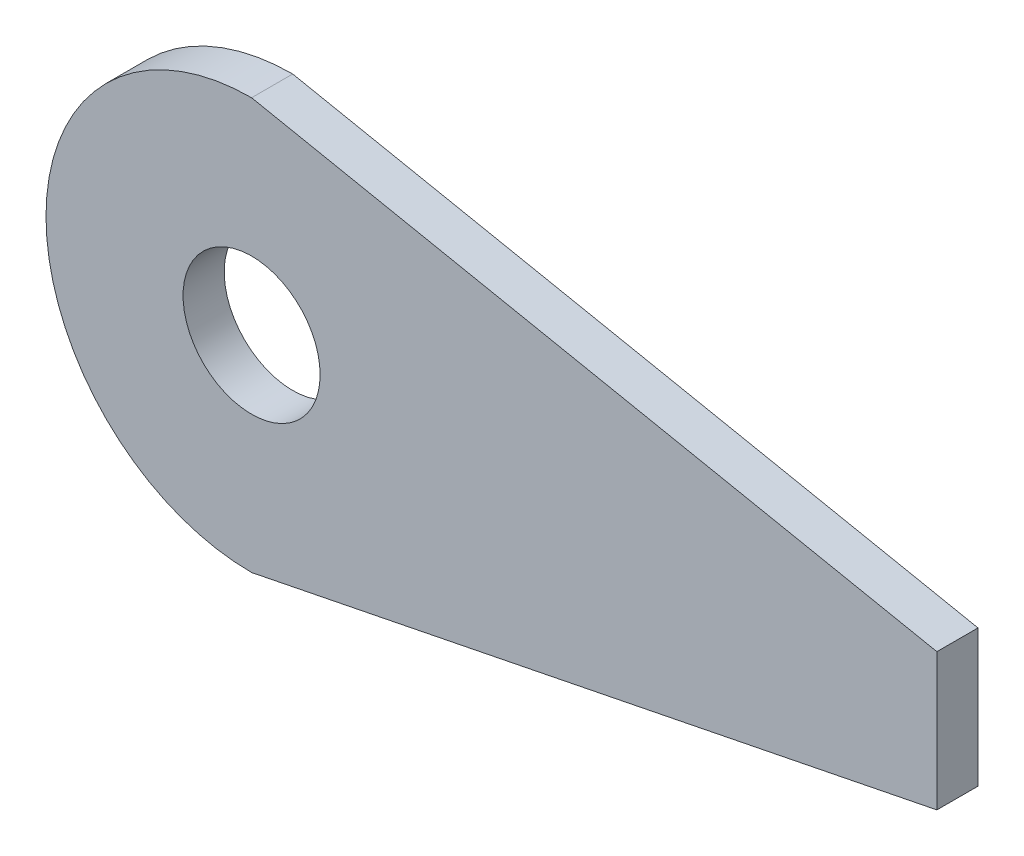
ISO-10303-21;
HEADER;
FILE_DESCRIPTION(('STEP AP214'),'2;1');
FILE_NAME('part.step','',(''),(''),'','','');
FILE_SCHEMA(('AUTOMOTIVE_DESIGN { 1 0 10303 214 1 1 1 1 }'));
ENDSEC;
DATA;
#1=APPLICATION_CONTEXT('core data for automotive mechanical design processes');
#2=APPLICATION_PROTOCOL_DEFINITION('international standard','automotive_design',2000,#1);
#3=PRODUCT_CONTEXT('',#1,'mechanical');
#4=PRODUCT('Part','Part','',(#3));
#5=PRODUCT_RELATED_PRODUCT_CATEGORY('part','',(#4));
#6=PRODUCT_DEFINITION_FORMATION('','',#4);
#7=PRODUCT_DEFINITION_CONTEXT('part definition',#1,'design');
#8=PRODUCT_DEFINITION('design','',#6,#7);
#9=PRODUCT_DEFINITION_SHAPE('','',#8);
#10=(LENGTH_UNIT() NAMED_UNIT(*) SI_UNIT(.MILLI.,.METRE.));
#11=(NAMED_UNIT(*) PLANE_ANGLE_UNIT() SI_UNIT($,.RADIAN.));
#12=(NAMED_UNIT(*) SI_UNIT($,.STERADIAN.) SOLID_ANGLE_UNIT());
#13=UNCERTAINTY_MEASURE_WITH_UNIT(LENGTH_MEASURE(1.E-05),#10,'distance_accuracy_value','');
#14=(GEOMETRIC_REPRESENTATION_CONTEXT(3) GLOBAL_UNCERTAINTY_ASSIGNED_CONTEXT((#13)) GLOBAL_UNIT_ASSIGNED_CONTEXT((#10,
#11,#12)) REPRESENTATION_CONTEXT('',''));
#15=CARTESIAN_POINT('',(0.,0.,0.));
#16=DIRECTION('',(0.,0.,1.));
#17=DIRECTION('',(1.,0.,0.));
#18=AXIS2_PLACEMENT_3D('',#15,#16,#17);
#19=CARTESIAN_POINT('',(0.,0.,3.));
#20=DIRECTION('',(0.,0.,1.));
#21=DIRECTION('',(1.,0.,0.));
#22=AXIS2_PLACEMENT_3D('',#19,#20,#21);
#23=PLANE('',#22);
#24=CARTESIAN_POINT('',(0.,0.,3.));
#25=DIRECTION('',(0.,0.,1.));
#26=DIRECTION('',(1.,0.,0.));
#27=AXIS2_PLACEMENT_3D('',#24,#25,#26);
#28=CIRCLE('',#27,15.);
#29=CARTESIAN_POINT('',(0.,15.,3.));
#30=VERTEX_POINT('',#29);
#31=CARTESIAN_POINT('',(0.,-15.,3.));
#32=VERTEX_POINT('',#31);
#33=EDGE_CURVE('E86',#30,#32,#28,.T.);
#34=ORIENTED_EDGE('',*,*,#33,.T.);
#35=DIRECTION('',(0.98058067569092,0.196116135138184,0.));
#36=VECTOR('',#35,1.);
#37=CARTESIAN_POINT('',(50.,-5.,3.));
#38=LINE('',#37,#36);
#39=CARTESIAN_POINT('',(50.,-5.,3.));
#40=VERTEX_POINT('',#39);
#41=EDGE_CURVE('E81',#32,#40,#38,.T.);
#42=ORIENTED_EDGE('',*,*,#41,.T.);
#43=DIRECTION('',(0.,1.,0.));
#44=VECTOR('',#43,1.);
#45=CARTESIAN_POINT('',(50.,5.,3.));
#46=LINE('',#45,#44);
#47=CARTESIAN_POINT('',(50.,5.,3.));
#48=VERTEX_POINT('',#47);
#49=EDGE_CURVE('E84',#40,#48,#46,.T.);
#50=ORIENTED_EDGE('',*,*,#49,.T.);
#51=DIRECTION('',(-0.98058067569092,0.196116135138184,0.));
#52=VECTOR('',#51,1.);
#53=CARTESIAN_POINT('',(0.,15.,3.));
#54=LINE('',#53,#52);
#55=EDGE_CURVE('E51',#48,#30,#54,.T.);
#56=ORIENTED_EDGE('',*,*,#55,.T.);
#57=EDGE_LOOP('',(#34,#42,#50,#56));
#58=FACE_BOUND('',#57,.T.);
#59=CARTESIAN_POINT('',(0.,0.,3.));
#60=DIRECTION('',(0.,0.,1.));
#61=DIRECTION('',(1.,0.,0.));
#62=AXIS2_PLACEMENT_3D('',#59,#60,#61);
#63=CIRCLE('',#62,5.);
#64=CARTESIAN_POINT('',(5.,0.,3.));
#65=VERTEX_POINT('',#64);
#66=EDGE_CURVE('E101',#65,#65,#63,.T.);
#67=ORIENTED_EDGE('',*,*,#66,.F.);
#68=EDGE_LOOP('',(#67));
#69=FACE_BOUND('',#68,.T.);
#70=ADVANCED_FACE('F34',(#58,#69),#23,.T.);
#71=CARTESIAN_POINT('',(0.,0.,0.));
#72=DIRECTION('',(0.,0.,1.));
#73=DIRECTION('',(1.,0.,0.));
#74=AXIS2_PLACEMENT_3D('',#71,#72,#73);
#75=PLANE('',#74);
#76=CARTESIAN_POINT('',(0.,0.,0.));
#77=DIRECTION('',(0.,0.,1.));
#78=DIRECTION('',(1.,0.,0.));
#79=AXIS2_PLACEMENT_3D('',#76,#77,#78);
#80=CIRCLE('',#79,15.);
#81=CARTESIAN_POINT('',(0.,15.,0.));
#82=VERTEX_POINT('',#81);
#83=CARTESIAN_POINT('',(0.,-15.,0.));
#84=VERTEX_POINT('',#83);
#85=EDGE_CURVE('E98',#82,#84,#80,.T.);
#86=ORIENTED_EDGE('',*,*,#85,.F.);
#87=DIRECTION('',(-0.98058067569092,0.196116135138184,0.));
#88=VECTOR('',#87,1.);
#89=CARTESIAN_POINT('',(0.,15.,0.));
#90=LINE('',#89,#88);
#91=CARTESIAN_POINT('',(50.,5.,0.));
#92=VERTEX_POINT('',#91);
#93=EDGE_CURVE('E74',#92,#82,#90,.T.);
#94=ORIENTED_EDGE('',*,*,#93,.F.);
#95=DIRECTION('',(0.,1.,0.));
#96=VECTOR('',#95,1.);
#97=CARTESIAN_POINT('',(50.,5.,0.));
#98=LINE('',#97,#96);
#99=CARTESIAN_POINT('',(50.,-5.,0.));
#100=VERTEX_POINT('',#99);
#101=EDGE_CURVE('E68',#100,#92,#98,.T.);
#102=ORIENTED_EDGE('',*,*,#101,.F.);
#103=DIRECTION('',(0.98058067569092,0.196116135138184,0.));
#104=VECTOR('',#103,1.);
#105=CARTESIAN_POINT('',(50.,-5.,0.));
#106=LINE('',#105,#104);
#107=EDGE_CURVE('E90',#84,#100,#106,.T.);
#108=ORIENTED_EDGE('',*,*,#107,.F.);
#109=EDGE_LOOP('',(#86,#94,#102,#108));
#110=FACE_BOUND('',#109,.T.);
#111=CARTESIAN_POINT('',(0.,0.,0.));
#112=DIRECTION('',(0.,0.,1.));
#113=DIRECTION('',(1.,0.,0.));
#114=AXIS2_PLACEMENT_3D('',#111,#112,#113);
#115=CIRCLE('',#114,5.);
#116=CARTESIAN_POINT('',(5.,0.,0.));
#117=VERTEX_POINT('',#116);
#118=EDGE_CURVE('E113',#117,#117,#115,.T.);
#119=ORIENTED_EDGE('',*,*,#118,.T.);
#120=EDGE_LOOP('',(#119));
#121=FACE_BOUND('',#120,.T.);
#122=ADVANCED_FACE('F109',(#110,#121),#75,.F.);
#123=CARTESIAN_POINT('',(0.,0.,3.));
#124=DIRECTION('',(0.,0.,-1.));
#125=DIRECTION('',(-1.,0.,0.));
#126=AXIS2_PLACEMENT_3D('',#123,#124,#125);
#127=CYLINDRICAL_SURFACE('',#126,15.);
#128=ORIENTED_EDGE('',*,*,#85,.T.);
#129=DIRECTION('',(0.,0.,-1.));
#130=VECTOR('',#129,1.);
#131=CARTESIAN_POINT('',(0.,-15.,3.));
#132=LINE('',#131,#130);
#133=EDGE_CURVE('E11',#32,#84,#132,.T.);
#134=ORIENTED_EDGE('',*,*,#133,.F.);
#135=ORIENTED_EDGE('',*,*,#33,.F.);
#136=DIRECTION('',(0.,0.,-1.));
#137=VECTOR('',#136,1.);
#138=CARTESIAN_POINT('',(0.,15.,3.));
#139=LINE('',#138,#137);
#140=EDGE_CURVE('E94',#30,#82,#139,.T.);
#141=ORIENTED_EDGE('',*,*,#140,.T.);
#142=EDGE_LOOP('',(#128,#134,#135,#141));
#143=FACE_BOUND('',#142,.T.);
#144=ADVANCED_FACE('F36',(#143),#127,.T.);
#145=CARTESIAN_POINT('',(50.,-5.,3.));
#146=DIRECTION('',(-0.196116135138184,0.98058067569092,0.));
#147=DIRECTION('',(-0.98058067569092,-0.196116135138184,0.));
#148=AXIS2_PLACEMENT_3D('',#145,#146,#147);
#149=PLANE('',#148);
#150=ORIENTED_EDGE('',*,*,#107,.T.);
#151=DIRECTION('',(0.,0.,-1.));
#152=VECTOR('',#151,1.);
#153=CARTESIAN_POINT('',(50.,-5.,3.));
#154=LINE('',#153,#152);
#155=EDGE_CURVE('E43',#40,#100,#154,.T.);
#156=ORIENTED_EDGE('',*,*,#155,.F.);
#157=ORIENTED_EDGE('',*,*,#41,.F.);
#158=ORIENTED_EDGE('',*,*,#133,.T.);
#159=EDGE_LOOP('',(#150,#156,#157,#158));
#160=FACE_BOUND('',#159,.T.);
#161=ADVANCED_FACE('F89',(#160),#149,.F.);
#162=CARTESIAN_POINT('',(50.,5.,3.));
#163=DIRECTION('',(-1.,0.,0.));
#164=DIRECTION('',(0.,0.,1.));
#165=AXIS2_PLACEMENT_3D('',#162,#163,#164);
#166=PLANE('',#165);
#167=ORIENTED_EDGE('',*,*,#101,.T.);
#168=DIRECTION('',(0.,0.,-1.));
#169=VECTOR('',#168,1.);
#170=CARTESIAN_POINT('',(50.,5.,3.));
#171=LINE('',#170,#169);
#172=EDGE_CURVE('E91',#48,#92,#171,.T.);
#173=ORIENTED_EDGE('',*,*,#172,.F.);
#174=ORIENTED_EDGE('',*,*,#49,.F.);
#175=ORIENTED_EDGE('',*,*,#155,.T.);
#176=EDGE_LOOP('',(#167,#173,#174,#175));
#177=FACE_BOUND('',#176,.T.);
#178=ADVANCED_FACE('F92',(#177),#166,.F.);
#179=CARTESIAN_POINT('',(0.,15.,3.));
#180=DIRECTION('',(-0.196116135138184,-0.98058067569092,0.));
#181=DIRECTION('',(0.98058067569092,-0.196116135138184,0.));
#182=AXIS2_PLACEMENT_3D('',#179,#180,#181);
#183=PLANE('',#182);
#184=ORIENTED_EDGE('',*,*,#93,.T.);
#185=ORIENTED_EDGE('',*,*,#140,.F.);
#186=ORIENTED_EDGE('',*,*,#55,.F.);
#187=ORIENTED_EDGE('',*,*,#172,.T.);
#188=EDGE_LOOP('',(#184,#185,#186,#187));
#189=FACE_BOUND('',#188,.T.);
#190=ADVANCED_FACE('F106',(#189),#183,.F.);
#191=CARTESIAN_POINT('',(0.,0.,3.));
#192=DIRECTION('',(0.,0.,-1.));
#193=DIRECTION('',(-1.,0.,0.));
#194=AXIS2_PLACEMENT_3D('',#191,#192,#193);
#195=CYLINDRICAL_SURFACE('',#194,5.);
#196=ORIENTED_EDGE('',*,*,#66,.T.);
#197=EDGE_LOOP('',(#196));
#198=FACE_BOUND('',#197,.T.);
#199=ORIENTED_EDGE('',*,*,#118,.F.);
#200=EDGE_LOOP('',(#199));
#201=FACE_BOUND('',#200,.T.);
#202=ADVANCED_FACE('F119',(#198,#201),#195,.F.);
#203=CLOSED_SHELL('',(#70,#122,#144,#161,#178,#190,#202));
#204=MANIFOLD_SOLID_BREP('B2',#203);
#205=ADVANCED_BREP_SHAPE_REPRESENTATION('',(#18,#204),#14);
#206=SHAPE_DEFINITION_REPRESENTATION(#9,#205);
ENDSEC;
END-ISO-10303-21;
